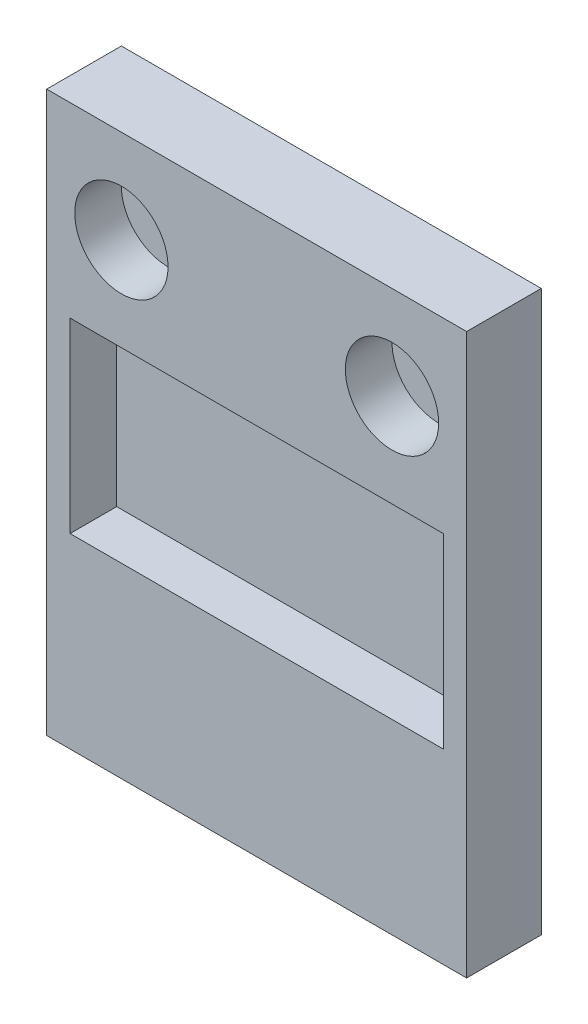
ISO-10303-21;
HEADER;
FILE_DESCRIPTION(('STEP AP214'),'2;1');
FILE_NAME('part.step','',(''),(''),'','','');
FILE_SCHEMA(('AUTOMOTIVE_DESIGN { 1 0 10303 214 1 1 1 1 }'));
ENDSEC;
DATA;
#1=APPLICATION_CONTEXT('core data for automotive mechanical design processes');
#2=APPLICATION_PROTOCOL_DEFINITION('international standard','automotive_design',2000,#1);
#3=PRODUCT_CONTEXT('',#1,'mechanical');
#4=PRODUCT('Part','Part','',(#3));
#5=PRODUCT_RELATED_PRODUCT_CATEGORY('part','',(#4));
#6=PRODUCT_DEFINITION_FORMATION('','',#4);
#7=PRODUCT_DEFINITION_CONTEXT('part definition',#1,'design');
#8=PRODUCT_DEFINITION('design','',#6,#7);
#9=PRODUCT_DEFINITION_SHAPE('','',#8);
#10=(LENGTH_UNIT() NAMED_UNIT(*) SI_UNIT(.MILLI.,.METRE.));
#11=(NAMED_UNIT(*) PLANE_ANGLE_UNIT() SI_UNIT($,.RADIAN.));
#12=(NAMED_UNIT(*) SI_UNIT($,.STERADIAN.) SOLID_ANGLE_UNIT());
#13=UNCERTAINTY_MEASURE_WITH_UNIT(LENGTH_MEASURE(1.E-05),#10,'distance_accuracy_value','');
#14=(GEOMETRIC_REPRESENTATION_CONTEXT(3) GLOBAL_UNCERTAINTY_ASSIGNED_CONTEXT((#13)) GLOBAL_UNIT_ASSIGNED_CONTEXT((#10,
#11,#12)) REPRESENTATION_CONTEXT('',''));
#15=CARTESIAN_POINT('',(0.,0.,0.));
#16=DIRECTION('',(0.,0.,1.));
#17=DIRECTION('',(1.,0.,0.));
#18=AXIS2_PLACEMENT_3D('',#15,#16,#17);
#19=CARTESIAN_POINT('',(22.5,30.,8.));
#20=DIRECTION('',(-1.,0.,0.));
#21=DIRECTION('',(0.,0.,1.));
#22=AXIS2_PLACEMENT_3D('',#19,#20,#21);
#23=PLANE('',#22);
#24=DIRECTION('',(0.,1.,0.));
#25=VECTOR('',#24,1.);
#26=CARTESIAN_POINT('',(22.5,30.,0.));
#27=LINE('',#26,#25);
#28=CARTESIAN_POINT('',(22.5,-30.,0.));
#29=VERTEX_POINT('',#28);
#30=CARTESIAN_POINT('',(22.5,30.,0.));
#31=VERTEX_POINT('',#30);
#32=EDGE_CURVE('E150',#29,#31,#27,.T.);
#33=ORIENTED_EDGE('',*,*,#32,.T.);
#34=DIRECTION('',(0.,0.,-1.));
#35=VECTOR('',#34,1.);
#36=CARTESIAN_POINT('',(22.5,30.,8.));
#37=LINE('',#36,#35);
#38=CARTESIAN_POINT('',(22.5,30.,8.));
#39=VERTEX_POINT('',#38);
#40=EDGE_CURVE('E11',#39,#31,#37,.T.);
#41=ORIENTED_EDGE('',*,*,#40,.F.);
#42=DIRECTION('',(0.,1.,0.));
#43=VECTOR('',#42,1.);
#44=CARTESIAN_POINT('',(22.5,30.,8.));
#45=LINE('',#44,#43);
#46=CARTESIAN_POINT('',(22.5,-30.,8.));
#47=VERTEX_POINT('',#46);
#48=EDGE_CURVE('E155',#47,#39,#45,.T.);
#49=ORIENTED_EDGE('',*,*,#48,.F.);
#50=DIRECTION('',(0.,0.,-1.));
#51=VECTOR('',#50,1.);
#52=CARTESIAN_POINT('',(22.5,-30.,8.));
#53=LINE('',#52,#51);
#54=EDGE_CURVE('E161',#47,#29,#53,.T.);
#55=ORIENTED_EDGE('',*,*,#54,.T.);
#56=EDGE_LOOP('',(#33,#41,#49,#55));
#57=FACE_BOUND('',#56,.T.);
#58=ADVANCED_FACE('F33',(#57),#23,.F.);
#59=CARTESIAN_POINT('',(-22.5,30.,8.));
#60=DIRECTION('',(0.,-1.,0.));
#61=DIRECTION('',(0.,0.,-1.));
#62=AXIS2_PLACEMENT_3D('',#59,#60,#61);
#63=PLANE('',#62);
#64=DIRECTION('',(-1.,0.,0.));
#65=VECTOR('',#64,1.);
#66=CARTESIAN_POINT('',(-22.5,30.,0.));
#67=LINE('',#66,#65);
#68=CARTESIAN_POINT('',(-22.5,30.,0.));
#69=VERTEX_POINT('',#68);
#70=EDGE_CURVE('E164',#31,#69,#67,.T.);
#71=ORIENTED_EDGE('',*,*,#70,.T.);
#72=DIRECTION('',(0.,0.,-1.));
#73=VECTOR('',#72,1.);
#74=CARTESIAN_POINT('',(-22.5,30.,8.));
#75=LINE('',#74,#73);
#76=CARTESIAN_POINT('',(-22.5,30.,8.));
#77=VERTEX_POINT('',#76);
#78=EDGE_CURVE('E40',#77,#69,#75,.T.);
#79=ORIENTED_EDGE('',*,*,#78,.F.);
#80=DIRECTION('',(-1.,0.,0.));
#81=VECTOR('',#80,1.);
#82=CARTESIAN_POINT('',(-22.5,30.,8.));
#83=LINE('',#82,#81);
#84=EDGE_CURVE('E84',#39,#77,#83,.T.);
#85=ORIENTED_EDGE('',*,*,#84,.F.);
#86=ORIENTED_EDGE('',*,*,#40,.T.);
#87=EDGE_LOOP('',(#71,#79,#85,#86));
#88=FACE_BOUND('',#87,.T.);
#89=ADVANCED_FACE('F193',(#88),#63,.F.);
#90=CARTESIAN_POINT('',(-22.5,30.,8.));
#91=DIRECTION('',(1.,0.,0.));
#92=DIRECTION('',(0.,1.,0.));
#93=AXIS2_PLACEMENT_3D('',#90,#91,#92);
#94=PLANE('',#93);
#95=DIRECTION('',(0.,-1.,0.));
#96=VECTOR('',#95,1.);
#97=CARTESIAN_POINT('',(-22.5,30.,0.));
#98=LINE('',#97,#96);
#99=CARTESIAN_POINT('',(-22.5,-30.,0.));
#100=VERTEX_POINT('',#99);
#101=EDGE_CURVE('E166',#69,#100,#98,.T.);
#102=ORIENTED_EDGE('',*,*,#101,.T.);
#103=DIRECTION('',(0.,0.,-1.));
#104=VECTOR('',#103,1.);
#105=CARTESIAN_POINT('',(-22.5,-30.,8.));
#106=LINE('',#105,#104);
#107=CARTESIAN_POINT('',(-22.5,-30.,8.));
#108=VERTEX_POINT('',#107);
#109=EDGE_CURVE('E170',#108,#100,#106,.T.);
#110=ORIENTED_EDGE('',*,*,#109,.F.);
#111=DIRECTION('',(0.,-1.,0.));
#112=VECTOR('',#111,1.);
#113=CARTESIAN_POINT('',(-22.5,30.,8.));
#114=LINE('',#113,#112);
#115=EDGE_CURVE('E158',#77,#108,#114,.T.);
#116=ORIENTED_EDGE('',*,*,#115,.F.);
#117=ORIENTED_EDGE('',*,*,#78,.T.);
#118=EDGE_LOOP('',(#102,#110,#116,#117));
#119=FACE_BOUND('',#118,.T.);
#120=ADVANCED_FACE('F175',(#119),#94,.F.);
#121=CARTESIAN_POINT('',(-22.5,-30.,8.));
#122=DIRECTION('',(0.,1.,0.));
#123=DIRECTION('',(0.,0.,1.));
#124=AXIS2_PLACEMENT_3D('',#121,#122,#123);
#125=PLANE('',#124);
#126=DIRECTION('',(1.,0.,0.));
#127=VECTOR('',#126,1.);
#128=CARTESIAN_POINT('',(-22.5,-30.,0.));
#129=LINE('',#128,#127);
#130=EDGE_CURVE('E77',#100,#29,#129,.T.);
#131=ORIENTED_EDGE('',*,*,#130,.T.);
#132=ORIENTED_EDGE('',*,*,#54,.F.);
#133=DIRECTION('',(1.,0.,0.));
#134=VECTOR('',#133,1.);
#135=CARTESIAN_POINT('',(-22.5,-30.,8.));
#136=LINE('',#135,#134);
#137=EDGE_CURVE('E56',#108,#47,#136,.T.);
#138=ORIENTED_EDGE('',*,*,#137,.F.);
#139=ORIENTED_EDGE('',*,*,#109,.T.);
#140=EDGE_LOOP('',(#131,#132,#138,#139));
#141=FACE_BOUND('',#140,.T.);
#142=ADVANCED_FACE('F183',(#141),#125,.F.);
#143=CARTESIAN_POINT('',(0.,0.,8.));
#144=DIRECTION('',(0.,0.,1.));
#145=DIRECTION('',(1.,0.,0.));
#146=AXIS2_PLACEMENT_3D('',#143,#144,#145);
#147=PLANE('',#146);
#148=DIRECTION('',(0.,-1.,0.));
#149=VECTOR('',#148,1.);
#150=CARTESIAN_POINT('',(-20.,10.,8.));
#151=LINE('',#150,#149);
#152=CARTESIAN_POINT('',(-20.,10.,8.));
#153=VERTEX_POINT('',#152);
#154=CARTESIAN_POINT('',(-20.,-9.99999999999999,8.));
#155=VERTEX_POINT('',#154);
#156=EDGE_CURVE('E47',#153,#155,#151,.T.);
#157=ORIENTED_EDGE('',*,*,#156,.F.);
#158=DIRECTION('',(-1.,0.,0.));
#159=VECTOR('',#158,1.);
#160=CARTESIAN_POINT('',(-20.,10.,8.));
#161=LINE('',#160,#159);
#162=CARTESIAN_POINT('',(20.,10.,8.));
#163=VERTEX_POINT('',#162);
#164=EDGE_CURVE('E126',#163,#153,#161,.T.);
#165=ORIENTED_EDGE('',*,*,#164,.F.);
#166=DIRECTION('',(0.,1.,0.));
#167=VECTOR('',#166,1.);
#168=CARTESIAN_POINT('',(20.,10.,8.));
#169=LINE('',#168,#167);
#170=CARTESIAN_POINT('',(20.,-9.99999999999999,8.));
#171=VERTEX_POINT('',#170);
#172=EDGE_CURVE('E129',#171,#163,#169,.T.);
#173=ORIENTED_EDGE('',*,*,#172,.F.);
#174=DIRECTION('',(1.,0.,0.));
#175=VECTOR('',#174,1.);
#176=CARTESIAN_POINT('',(-20.,-9.99999999999999,8.));
#177=LINE('',#176,#175);
#178=EDGE_CURVE('E138',#155,#171,#177,.T.);
#179=ORIENTED_EDGE('',*,*,#178,.F.);
#180=EDGE_LOOP('',(#157,#165,#173,#179));
#181=FACE_BOUND('',#180,.T.);
#182=CARTESIAN_POINT('',(14.5,20.,8.));
#183=DIRECTION('',(0.,0.,1.));
#184=DIRECTION('',(1.,0.,0.));
#185=AXIS2_PLACEMENT_3D('',#182,#183,#184);
#186=CIRCLE('',#185,5.);
#187=CARTESIAN_POINT('',(19.5,20.,8.));
#188=VERTEX_POINT('',#187);
#189=EDGE_CURVE('E132',#188,#188,#186,.T.);
#190=ORIENTED_EDGE('',*,*,#189,.F.);
#191=EDGE_LOOP('',(#190));
#192=FACE_BOUND('',#191,.T.);
#193=CARTESIAN_POINT('',(-14.5,20.,8.));
#194=DIRECTION('',(0.,0.,1.));
#195=DIRECTION('',(1.,0.,0.));
#196=AXIS2_PLACEMENT_3D('',#193,#194,#195);
#197=CIRCLE('',#196,5.);
#198=CARTESIAN_POINT('',(-9.5,20.,8.));
#199=VERTEX_POINT('',#198);
#200=EDGE_CURVE('E151',#199,#199,#197,.T.);
#201=ORIENTED_EDGE('',*,*,#200,.F.);
#202=EDGE_LOOP('',(#201));
#203=FACE_BOUND('',#202,.T.);
#204=ORIENTED_EDGE('',*,*,#48,.T.);
#205=ORIENTED_EDGE('',*,*,#84,.T.);
#206=ORIENTED_EDGE('',*,*,#115,.T.);
#207=ORIENTED_EDGE('',*,*,#137,.T.);
#208=EDGE_LOOP('',(#204,#205,#206,#207));
#209=FACE_BOUND('',#208,.T.);
#210=ADVANCED_FACE('F185',(#181,#192,#203,#209),#147,.T.);
#211=CARTESIAN_POINT('',(0.,0.,0.));
#212=DIRECTION('',(0.,0.,1.));
#213=DIRECTION('',(1.,0.,0.));
#214=AXIS2_PLACEMENT_3D('',#211,#212,#213);
#215=PLANE('',#214);
#216=ORIENTED_EDGE('',*,*,#32,.F.);
#217=ORIENTED_EDGE('',*,*,#130,.F.);
#218=ORIENTED_EDGE('',*,*,#101,.F.);
#219=ORIENTED_EDGE('',*,*,#70,.F.);
#220=EDGE_LOOP('',(#216,#217,#218,#219));
#221=FACE_BOUND('',#220,.T.);
#222=ADVANCED_FACE('F179',(#221),#215,.F.);
#223=CARTESIAN_POINT('',(-14.5,20.,3.));
#224=DIRECTION('',(0.,0.,1.));
#225=DIRECTION('',(1.,0.,0.));
#226=AXIS2_PLACEMENT_3D('',#223,#224,#225);
#227=CYLINDRICAL_SURFACE('',#226,5.);
#228=CARTESIAN_POINT('',(-14.5,20.,3.));
#229=DIRECTION('',(0.,0.,1.));
#230=DIRECTION('',(1.,0.,0.));
#231=AXIS2_PLACEMENT_3D('',#228,#229,#230);
#232=CIRCLE('',#231,5.);
#233=CARTESIAN_POINT('',(-9.5,20.,3.));
#234=VERTEX_POINT('',#233);
#235=EDGE_CURVE('E147',#234,#234,#232,.T.);
#236=ORIENTED_EDGE('',*,*,#235,.F.);
#237=EDGE_LOOP('',(#236));
#238=FACE_BOUND('',#237,.T.);
#239=ORIENTED_EDGE('',*,*,#200,.T.);
#240=EDGE_LOOP('',(#239));
#241=FACE_BOUND('',#240,.T.);
#242=ADVANCED_FACE('F220',(#238,#241),#227,.F.);
#243=CARTESIAN_POINT('',(-14.5,20.,3.));
#244=DIRECTION('',(0.,0.,1.));
#245=DIRECTION('',(1.,0.,0.));
#246=AXIS2_PLACEMENT_3D('',#243,#244,#245);
#247=PLANE('',#246);
#248=ORIENTED_EDGE('',*,*,#235,.T.);
#249=EDGE_LOOP('',(#248));
#250=FACE_BOUND('',#249,.T.);
#251=ADVANCED_FACE('F233',(#250),#247,.T.);
#252=CARTESIAN_POINT('',(14.5,20.,3.));
#253=DIRECTION('',(0.,0.,1.));
#254=DIRECTION('',(1.,0.,0.));
#255=AXIS2_PLACEMENT_3D('',#252,#253,#254);
#256=CYLINDRICAL_SURFACE('',#255,5.);
#257=CARTESIAN_POINT('',(14.5,20.,3.));
#258=DIRECTION('',(0.,0.,1.));
#259=DIRECTION('',(1.,0.,0.));
#260=AXIS2_PLACEMENT_3D('',#257,#258,#259);
#261=CIRCLE('',#260,5.);
#262=CARTESIAN_POINT('',(19.5,20.,3.));
#263=VERTEX_POINT('',#262);
#264=EDGE_CURVE('E154',#263,#263,#261,.T.);
#265=ORIENTED_EDGE('',*,*,#264,.F.);
#266=EDGE_LOOP('',(#265));
#267=FACE_BOUND('',#266,.T.);
#268=ORIENTED_EDGE('',*,*,#189,.T.);
#269=EDGE_LOOP('',(#268));
#270=FACE_BOUND('',#269,.T.);
#271=ADVANCED_FACE('F243',(#267,#270),#256,.F.);
#272=CARTESIAN_POINT('',(14.5,20.,3.));
#273=DIRECTION('',(0.,0.,1.));
#274=DIRECTION('',(1.,0.,0.));
#275=AXIS2_PLACEMENT_3D('',#272,#273,#274);
#276=PLANE('',#275);
#277=ORIENTED_EDGE('',*,*,#264,.T.);
#278=EDGE_LOOP('',(#277));
#279=FACE_BOUND('',#278,.T.);
#280=ADVANCED_FACE('F253',(#279),#276,.T.);
#281=CARTESIAN_POINT('',(-20.,10.,3.));
#282=DIRECTION('',(-1.,0.,0.));
#283=DIRECTION('',(0.,-1.,0.));
#284=AXIS2_PLACEMENT_3D('',#281,#282,#283);
#285=PLANE('',#284);
#286=ORIENTED_EDGE('',*,*,#156,.T.);
#287=DIRECTION('',(0.,0.,1.));
#288=VECTOR('',#287,1.);
#289=CARTESIAN_POINT('',(-20.,-9.99999999999999,3.));
#290=LINE('',#289,#288);
#291=CARTESIAN_POINT('',(-20.,-9.99999999999999,3.));
#292=VERTEX_POINT('',#291);
#293=EDGE_CURVE('E104',#292,#155,#290,.T.);
#294=ORIENTED_EDGE('',*,*,#293,.F.);
#295=DIRECTION('',(0.,-1.,0.));
#296=VECTOR('',#295,1.);
#297=CARTESIAN_POINT('',(-20.,10.,3.));
#298=LINE('',#297,#296);
#299=CARTESIAN_POINT('',(-20.,10.,3.));
#300=VERTEX_POINT('',#299);
#301=EDGE_CURVE('E108',#300,#292,#298,.T.);
#302=ORIENTED_EDGE('',*,*,#301,.F.);
#303=DIRECTION('',(0.,0.,1.));
#304=VECTOR('',#303,1.);
#305=CARTESIAN_POINT('',(-20.,10.,3.));
#306=LINE('',#305,#304);
#307=EDGE_CURVE('E142',#300,#153,#306,.T.);
#308=ORIENTED_EDGE('',*,*,#307,.T.);
#309=EDGE_LOOP('',(#286,#294,#302,#308));
#310=FACE_BOUND('',#309,.T.);
#311=ADVANCED_FACE('F106',(#310),#285,.F.);
#312=CARTESIAN_POINT('',(-20.,10.,3.));
#313=DIRECTION('',(0.,1.,0.));
#314=DIRECTION('',(0.,0.,1.));
#315=AXIS2_PLACEMENT_3D('',#312,#313,#314);
#316=PLANE('',#315);
#317=ORIENTED_EDGE('',*,*,#164,.T.);
#318=ORIENTED_EDGE('',*,*,#307,.F.);
#319=DIRECTION('',(-1.,0.,0.));
#320=VECTOR('',#319,1.);
#321=CARTESIAN_POINT('',(-20.,10.,3.));
#322=LINE('',#321,#320);
#323=CARTESIAN_POINT('',(20.,10.,3.));
#324=VERTEX_POINT('',#323);
#325=EDGE_CURVE('E114',#324,#300,#322,.T.);
#326=ORIENTED_EDGE('',*,*,#325,.F.);
#327=DIRECTION('',(0.,0.,1.));
#328=VECTOR('',#327,1.);
#329=CARTESIAN_POINT('',(20.,10.,3.));
#330=LINE('',#329,#328);
#331=EDGE_CURVE('E144',#324,#163,#330,.T.);
#332=ORIENTED_EDGE('',*,*,#331,.T.);
#333=EDGE_LOOP('',(#317,#318,#326,#332));
#334=FACE_BOUND('',#333,.T.);
#335=ADVANCED_FACE('F272',(#334),#316,.F.);
#336=CARTESIAN_POINT('',(20.,10.,3.));
#337=DIRECTION('',(1.,0.,0.));
#338=DIRECTION('',(0.,1.,0.));
#339=AXIS2_PLACEMENT_3D('',#336,#337,#338);
#340=PLANE('',#339);
#341=ORIENTED_EDGE('',*,*,#172,.T.);
#342=ORIENTED_EDGE('',*,*,#331,.F.);
#343=DIRECTION('',(0.,1.,0.));
#344=VECTOR('',#343,1.);
#345=CARTESIAN_POINT('',(20.,10.,3.));
#346=LINE('',#345,#344);
#347=CARTESIAN_POINT('',(20.,-9.99999999999999,3.));
#348=VERTEX_POINT('',#347);
#349=EDGE_CURVE('E122',#348,#324,#346,.T.);
#350=ORIENTED_EDGE('',*,*,#349,.F.);
#351=DIRECTION('',(0.,0.,1.));
#352=VECTOR('',#351,1.);
#353=CARTESIAN_POINT('',(20.,-9.99999999999999,3.));
#354=LINE('',#353,#352);
#355=EDGE_CURVE('E113',#348,#171,#354,.T.);
#356=ORIENTED_EDGE('',*,*,#355,.T.);
#357=EDGE_LOOP('',(#341,#342,#350,#356));
#358=FACE_BOUND('',#357,.T.);
#359=ADVANCED_FACE('F281',(#358),#340,.F.);
#360=CARTESIAN_POINT('',(-20.,-9.99999999999999,3.));
#361=DIRECTION('',(0.,-1.,0.));
#362=DIRECTION('',(0.,0.,-1.));
#363=AXIS2_PLACEMENT_3D('',#360,#361,#362);
#364=PLANE('',#363);
#365=ORIENTED_EDGE('',*,*,#178,.T.);
#366=ORIENTED_EDGE('',*,*,#355,.F.);
#367=DIRECTION('',(1.,0.,0.));
#368=VECTOR('',#367,1.);
#369=CARTESIAN_POINT('',(-20.,-9.99999999999999,3.));
#370=LINE('',#369,#368);
#371=EDGE_CURVE('E117',#292,#348,#370,.T.);
#372=ORIENTED_EDGE('',*,*,#371,.F.);
#373=ORIENTED_EDGE('',*,*,#293,.T.);
#374=EDGE_LOOP('',(#365,#366,#372,#373));
#375=FACE_BOUND('',#374,.T.);
#376=ADVANCED_FACE('F118',(#375),#364,.F.);
#377=CARTESIAN_POINT('',(0.,0.,3.));
#378=DIRECTION('',(0.,0.,1.));
#379=DIRECTION('',(1.,0.,0.));
#380=AXIS2_PLACEMENT_3D('',#377,#378,#379);
#381=PLANE('',#380);
#382=ORIENTED_EDGE('',*,*,#301,.T.);
#383=ORIENTED_EDGE('',*,*,#371,.T.);
#384=ORIENTED_EDGE('',*,*,#349,.T.);
#385=ORIENTED_EDGE('',*,*,#325,.T.);
#386=EDGE_LOOP('',(#382,#383,#384,#385));
#387=FACE_BOUND('',#386,.T.);
#388=ADVANCED_FACE('F124',(#387),#381,.T.);
#389=CLOSED_SHELL('',(#58,#89,#120,#142,#210,#222,#242,#251,#271,#280,#311,#335,#359,#376,#388));
#390=MANIFOLD_SOLID_BREP('B2',#389);
#391=ADVANCED_BREP_SHAPE_REPRESENTATION('',(#18,#390),#14);
#392=SHAPE_DEFINITION_REPRESENTATION(#9,#391);
ENDSEC;
END-ISO-10303-21;
